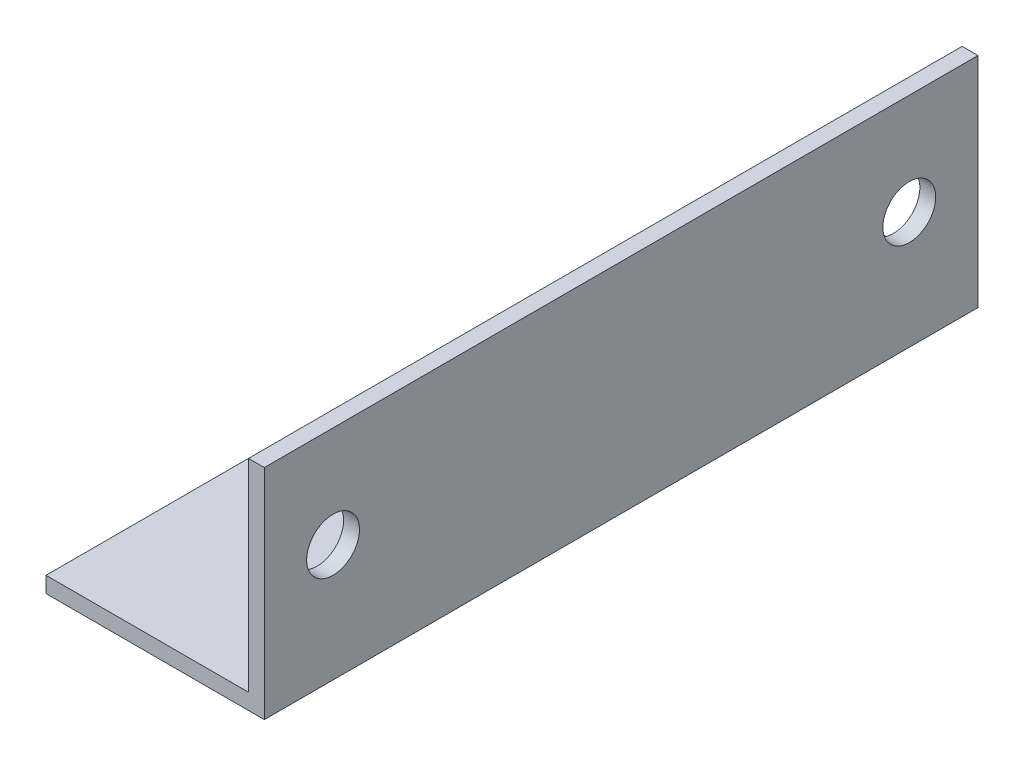
ISO-10303-21;
HEADER;
FILE_DESCRIPTION(('STEP AP214'),'2;1');
FILE_NAME('part.step','',(''),(''),'','','');
FILE_SCHEMA(('AUTOMOTIVE_DESIGN { 1 0 10303 214 1 1 1 1 }'));
ENDSEC;
DATA;
#1=APPLICATION_CONTEXT('core data for automotive mechanical design processes');
#2=APPLICATION_PROTOCOL_DEFINITION('international standard','automotive_design',2000,#1);
#3=PRODUCT_CONTEXT('',#1,'mechanical');
#4=PRODUCT('Part','Part','',(#3));
#5=PRODUCT_RELATED_PRODUCT_CATEGORY('part','',(#4));
#6=PRODUCT_DEFINITION_FORMATION('','',#4);
#7=PRODUCT_DEFINITION_CONTEXT('part definition',#1,'design');
#8=PRODUCT_DEFINITION('design','',#6,#7);
#9=PRODUCT_DEFINITION_SHAPE('','',#8);
#10=(LENGTH_UNIT() NAMED_UNIT(*) SI_UNIT(.MILLI.,.METRE.));
#11=(NAMED_UNIT(*) PLANE_ANGLE_UNIT() SI_UNIT($,.RADIAN.));
#12=(NAMED_UNIT(*) SI_UNIT($,.STERADIAN.) SOLID_ANGLE_UNIT());
#13=UNCERTAINTY_MEASURE_WITH_UNIT(LENGTH_MEASURE(1.E-05),#10,'distance_accuracy_value','');
#14=(GEOMETRIC_REPRESENTATION_CONTEXT(3) GLOBAL_UNCERTAINTY_ASSIGNED_CONTEXT((#13)) GLOBAL_UNIT_ASSIGNED_CONTEXT((#10,
#11,#12)) REPRESENTATION_CONTEXT('',''));
#15=CARTESIAN_POINT('',(0.,0.,0.));
#16=DIRECTION('',(0.,0.,1.));
#17=DIRECTION('',(1.,0.,0.));
#18=AXIS2_PLACEMENT_3D('',#15,#16,#17);
#19=CARTESIAN_POINT('',(0.,1.2,54.));
#20=DIRECTION('',(1.,0.,0.));
#21=DIRECTION('',(0.,1.,0.));
#22=AXIS2_PLACEMENT_3D('',#19,#20,#21);
#23=PLANE('',#22);
#24=DIRECTION('',(0.,-1.,0.));
#25=VECTOR('',#24,1.);
#26=CARTESIAN_POINT('',(0.,1.2,0.));
#27=LINE('',#26,#25);
#28=CARTESIAN_POINT('',(0.,1.2,0.));
#29=VERTEX_POINT('',#28);
#30=CARTESIAN_POINT('',(0.,0.,0.));
#31=VERTEX_POINT('',#30);
#32=EDGE_CURVE('E130',#29,#31,#27,.T.);
#33=ORIENTED_EDGE('',*,*,#32,.T.);
#34=DIRECTION('',(0.,0.,-1.));
#35=VECTOR('',#34,1.);
#36=CARTESIAN_POINT('',(0.,0.,54.));
#37=LINE('',#36,#35);
#38=CARTESIAN_POINT('',(0.,0.,54.));
#39=VERTEX_POINT('',#38);
#40=EDGE_CURVE('E11',#39,#31,#37,.T.);
#41=ORIENTED_EDGE('',*,*,#40,.F.);
#42=DIRECTION('',(0.,-1.,0.));
#43=VECTOR('',#42,1.);
#44=CARTESIAN_POINT('',(0.,1.2,54.));
#45=LINE('',#44,#43);
#46=CARTESIAN_POINT('',(0.,1.2,54.));
#47=VERTEX_POINT('',#46);
#48=EDGE_CURVE('E147',#47,#39,#45,.T.);
#49=ORIENTED_EDGE('',*,*,#48,.F.);
#50=DIRECTION('',(0.,0.,-1.));
#51=VECTOR('',#50,1.);
#52=CARTESIAN_POINT('',(0.,1.2,54.));
#53=LINE('',#52,#51);
#54=EDGE_CURVE('E126',#47,#29,#53,.T.);
#55=ORIENTED_EDGE('',*,*,#54,.T.);
#56=EDGE_LOOP('',(#33,#41,#49,#55));
#57=FACE_BOUND('',#56,.T.);
#58=ADVANCED_FACE('F39',(#57),#23,.F.);
#59=CARTESIAN_POINT('',(0.,0.,54.));
#60=DIRECTION('',(0.,1.,0.));
#61=DIRECTION('',(0.,0.,1.));
#62=AXIS2_PLACEMENT_3D('',#59,#60,#61);
#63=PLANE('',#62);
#64=DIRECTION('',(1.,0.,0.));
#65=VECTOR('',#64,1.);
#66=CARTESIAN_POINT('',(0.,0.,0.));
#67=LINE('',#66,#65);
#68=CARTESIAN_POINT('',(16.52,0.,0.));
#69=VERTEX_POINT('',#68);
#70=EDGE_CURVE('E134',#31,#69,#67,.T.);
#71=ORIENTED_EDGE('',*,*,#70,.T.);
#72=DIRECTION('',(0.,0.,-1.));
#73=VECTOR('',#72,1.);
#74=CARTESIAN_POINT('',(16.52,0.,54.));
#75=LINE('',#74,#73);
#76=CARTESIAN_POINT('',(16.52,0.,54.));
#77=VERTEX_POINT('',#76);
#78=EDGE_CURVE('E49',#77,#69,#75,.T.);
#79=ORIENTED_EDGE('',*,*,#78,.F.);
#80=DIRECTION('',(1.,0.,0.));
#81=VECTOR('',#80,1.);
#82=CARTESIAN_POINT('',(0.,0.,54.));
#83=LINE('',#82,#81);
#84=EDGE_CURVE('E95',#39,#77,#83,.T.);
#85=ORIENTED_EDGE('',*,*,#84,.F.);
#86=ORIENTED_EDGE('',*,*,#40,.T.);
#87=EDGE_LOOP('',(#71,#79,#85,#86));
#88=FACE_BOUND('',#87,.T.);
#89=ADVANCED_FACE('F179',(#88),#63,.F.);
#90=CARTESIAN_POINT('',(16.52,0.,54.));
#91=DIRECTION('',(-1.,0.,0.));
#92=DIRECTION('',(0.,0.,1.));
#93=AXIS2_PLACEMENT_3D('',#90,#91,#92);
#94=PLANE('',#93);
#95=CARTESIAN_POINT('',(16.52,8.86,5.2));
#96=DIRECTION('',(-1.,0.,0.));
#97=DIRECTION('',(0.,0.,1.));
#98=AXIS2_PLACEMENT_3D('',#95,#96,#97);
#99=CIRCLE('',#98,2.);
#100=CARTESIAN_POINT('',(16.52,8.86,7.2));
#101=VERTEX_POINT('',#100);
#102=EDGE_CURVE('E135',#101,#101,#99,.F.);
#103=ORIENTED_EDGE('',*,*,#102,.F.);
#104=EDGE_LOOP('',(#103));
#105=FACE_BOUND('',#104,.T.);
#106=CARTESIAN_POINT('',(16.52,8.86,48.8));
#107=DIRECTION('',(-1.,0.,0.));
#108=DIRECTION('',(0.,0.,1.));
#109=AXIS2_PLACEMENT_3D('',#106,#107,#108);
#110=CIRCLE('',#109,2.);
#111=CARTESIAN_POINT('',(16.52,8.86,50.8));
#112=VERTEX_POINT('',#111);
#113=EDGE_CURVE('E159',#112,#112,#110,.F.);
#114=ORIENTED_EDGE('',*,*,#113,.F.);
#115=EDGE_LOOP('',(#114));
#116=FACE_BOUND('',#115,.T.);
#117=DIRECTION('',(0.,1.,0.));
#118=VECTOR('',#117,1.);
#119=CARTESIAN_POINT('',(16.52,0.,0.));
#120=LINE('',#119,#118);
#121=CARTESIAN_POINT('',(16.52,16.52,0.));
#122=VERTEX_POINT('',#121);
#123=EDGE_CURVE('E138',#69,#122,#120,.T.);
#124=ORIENTED_EDGE('',*,*,#123,.T.);
#125=DIRECTION('',(0.,0.,-1.));
#126=VECTOR('',#125,1.);
#127=CARTESIAN_POINT('',(16.52,16.52,54.));
#128=LINE('',#127,#126);
#129=CARTESIAN_POINT('',(16.52,16.52,54.));
#130=VERTEX_POINT('',#129);
#131=EDGE_CURVE('E119',#130,#122,#128,.T.);
#132=ORIENTED_EDGE('',*,*,#131,.F.);
#133=DIRECTION('',(0.,1.,0.));
#134=VECTOR('',#133,1.);
#135=CARTESIAN_POINT('',(16.52,0.,54.));
#136=LINE('',#135,#134);
#137=EDGE_CURVE('E108',#77,#130,#136,.T.);
#138=ORIENTED_EDGE('',*,*,#137,.F.);
#139=ORIENTED_EDGE('',*,*,#78,.T.);
#140=EDGE_LOOP('',(#124,#132,#138,#139));
#141=FACE_BOUND('',#140,.T.);
#142=ADVANCED_FACE('F182',(#105,#116,#141),#94,.F.);
#143=CARTESIAN_POINT('',(16.52,16.52,54.));
#144=DIRECTION('',(0.,-1.,0.));
#145=DIRECTION('',(0.,0.,-1.));
#146=AXIS2_PLACEMENT_3D('',#143,#144,#145);
#147=PLANE('',#146);
#148=DIRECTION('',(-1.,0.,0.));
#149=VECTOR('',#148,1.);
#150=CARTESIAN_POINT('',(16.52,16.52,0.));
#151=LINE('',#150,#149);
#152=CARTESIAN_POINT('',(15.32,16.52,0.));
#153=VERTEX_POINT('',#152);
#154=EDGE_CURVE('E117',#122,#153,#151,.T.);
#155=ORIENTED_EDGE('',*,*,#154,.T.);
#156=DIRECTION('',(0.,0.,-1.));
#157=VECTOR('',#156,1.);
#158=CARTESIAN_POINT('',(15.32,16.52,54.));
#159=LINE('',#158,#157);
#160=CARTESIAN_POINT('',(15.32,16.52,54.));
#161=VERTEX_POINT('',#160);
#162=EDGE_CURVE('E114',#161,#153,#159,.T.);
#163=ORIENTED_EDGE('',*,*,#162,.F.);
#164=DIRECTION('',(-1.,0.,0.));
#165=VECTOR('',#164,1.);
#166=CARTESIAN_POINT('',(16.52,16.52,54.));
#167=LINE('',#166,#165);
#168=EDGE_CURVE('E102',#130,#161,#167,.T.);
#169=ORIENTED_EDGE('',*,*,#168,.F.);
#170=ORIENTED_EDGE('',*,*,#131,.T.);
#171=EDGE_LOOP('',(#155,#163,#169,#170));
#172=FACE_BOUND('',#171,.T.);
#173=ADVANCED_FACE('F115',(#172),#147,.F.);
#174=CARTESIAN_POINT('',(15.32,16.52,54.));
#175=DIRECTION('',(1.,0.,0.));
#176=DIRECTION('',(0.,1.,0.));
#177=AXIS2_PLACEMENT_3D('',#174,#175,#176);
#178=PLANE('',#177);
#179=CARTESIAN_POINT('',(15.32,8.86,5.2));
#180=DIRECTION('',(1.,0.,0.));
#181=DIRECTION('',(0.,1.,0.));
#182=AXIS2_PLACEMENT_3D('',#179,#180,#181);
#183=CIRCLE('',#182,2.);
#184=CARTESIAN_POINT('',(15.32,10.86,5.2));
#185=VERTEX_POINT('',#184);
#186=EDGE_CURVE('E42',#185,#185,#183,.F.);
#187=ORIENTED_EDGE('',*,*,#186,.F.);
#188=EDGE_LOOP('',(#187));
#189=FACE_BOUND('',#188,.T.);
#190=CARTESIAN_POINT('',(15.32,8.86,48.8));
#191=DIRECTION('',(1.,0.,0.));
#192=DIRECTION('',(0.,1.,0.));
#193=AXIS2_PLACEMENT_3D('',#190,#191,#192);
#194=CIRCLE('',#193,2.);
#195=CARTESIAN_POINT('',(15.32,10.86,48.8));
#196=VERTEX_POINT('',#195);
#197=EDGE_CURVE('E156',#196,#196,#194,.F.);
#198=ORIENTED_EDGE('',*,*,#197,.F.);
#199=EDGE_LOOP('',(#198));
#200=FACE_BOUND('',#199,.T.);
#201=DIRECTION('',(0.,-1.,0.));
#202=VECTOR('',#201,1.);
#203=CARTESIAN_POINT('',(15.32,16.52,0.));
#204=LINE('',#203,#202);
#205=CARTESIAN_POINT('',(15.32,1.2,0.));
#206=VERTEX_POINT('',#205);
#207=EDGE_CURVE('E81',#153,#206,#204,.T.);
#208=ORIENTED_EDGE('',*,*,#207,.T.);
#209=DIRECTION('',(0.,0.,-1.));
#210=VECTOR('',#209,1.);
#211=CARTESIAN_POINT('',(15.32,1.2,54.));
#212=LINE('',#211,#210);
#213=CARTESIAN_POINT('',(15.32,1.2,54.));
#214=VERTEX_POINT('',#213);
#215=EDGE_CURVE('E120',#214,#206,#212,.T.);
#216=ORIENTED_EDGE('',*,*,#215,.F.);
#217=DIRECTION('',(0.,-1.,0.));
#218=VECTOR('',#217,1.);
#219=CARTESIAN_POINT('',(15.32,16.52,54.));
#220=LINE('',#219,#218);
#221=EDGE_CURVE('E106',#161,#214,#220,.T.);
#222=ORIENTED_EDGE('',*,*,#221,.F.);
#223=ORIENTED_EDGE('',*,*,#162,.T.);
#224=EDGE_LOOP('',(#208,#216,#222,#223));
#225=FACE_BOUND('',#224,.T.);
#226=ADVANCED_FACE('F122',(#189,#200,#225),#178,.F.);
#227=CARTESIAN_POINT('',(15.32,1.2,54.));
#228=DIRECTION('',(0.,-1.,0.));
#229=DIRECTION('',(1.,0.,0.));
#230=AXIS2_PLACEMENT_3D('',#227,#228,#229);
#231=PLANE('',#230);
#232=DIRECTION('',(-1.,0.,0.));
#233=VECTOR('',#232,1.);
#234=CARTESIAN_POINT('',(15.32,1.2,0.));
#235=LINE('',#234,#233);
#236=EDGE_CURVE('E87',#206,#29,#235,.T.);
#237=ORIENTED_EDGE('',*,*,#236,.T.);
#238=ORIENTED_EDGE('',*,*,#54,.F.);
#239=DIRECTION('',(-1.,0.,0.));
#240=VECTOR('',#239,1.);
#241=CARTESIAN_POINT('',(15.32,1.2,54.));
#242=LINE('',#241,#240);
#243=EDGE_CURVE('E58',#214,#47,#242,.T.);
#244=ORIENTED_EDGE('',*,*,#243,.F.);
#245=ORIENTED_EDGE('',*,*,#215,.T.);
#246=EDGE_LOOP('',(#237,#238,#244,#245));
#247=FACE_BOUND('',#246,.T.);
#248=ADVANCED_FACE('F187',(#247),#231,.F.);
#249=CARTESIAN_POINT('',(0.,0.,54.));
#250=DIRECTION('',(0.,0.,1.));
#251=DIRECTION('',(1.,0.,0.));
#252=AXIS2_PLACEMENT_3D('',#249,#250,#251);
#253=PLANE('',#252);
#254=ORIENTED_EDGE('',*,*,#48,.T.);
#255=ORIENTED_EDGE('',*,*,#84,.T.);
#256=ORIENTED_EDGE('',*,*,#137,.T.);
#257=ORIENTED_EDGE('',*,*,#168,.T.);
#258=ORIENTED_EDGE('',*,*,#221,.T.);
#259=ORIENTED_EDGE('',*,*,#243,.T.);
#260=EDGE_LOOP('',(#254,#255,#256,#257,#258,#259));
#261=FACE_BOUND('',#260,.T.);
#262=ADVANCED_FACE('F104',(#261),#253,.T.);
#263=CARTESIAN_POINT('',(0.,0.,0.));
#264=DIRECTION('',(0.,0.,1.));
#265=DIRECTION('',(1.,0.,0.));
#266=AXIS2_PLACEMENT_3D('',#263,#264,#265);
#267=PLANE('',#266);
#268=ORIENTED_EDGE('',*,*,#32,.F.);
#269=ORIENTED_EDGE('',*,*,#236,.F.);
#270=ORIENTED_EDGE('',*,*,#207,.F.);
#271=ORIENTED_EDGE('',*,*,#154,.F.);
#272=ORIENTED_EDGE('',*,*,#123,.F.);
#273=ORIENTED_EDGE('',*,*,#70,.F.);
#274=EDGE_LOOP('',(#268,#269,#270,#271,#272,#273));
#275=FACE_BOUND('',#274,.T.);
#276=ADVANCED_FACE('F185',(#275),#267,.F.);
#277=CARTESIAN_POINT('',(24.,8.86,48.8));
#278=DIRECTION('',(-1.,0.,0.));
#279=DIRECTION('',(0.,0.,1.));
#280=AXIS2_PLACEMENT_3D('',#277,#278,#279);
#281=CYLINDRICAL_SURFACE('',#280,2.);
#282=ORIENTED_EDGE('',*,*,#197,.T.);
#283=EDGE_LOOP('',(#282));
#284=FACE_BOUND('',#283,.T.);
#285=ORIENTED_EDGE('',*,*,#113,.T.);
#286=EDGE_LOOP('',(#285));
#287=FACE_BOUND('',#286,.T.);
#288=ADVANCED_FACE('F226',(#284,#287),#281,.F.);
#289=CARTESIAN_POINT('',(24.,8.86,5.2));
#290=DIRECTION('',(-1.,0.,0.));
#291=DIRECTION('',(0.,0.,1.));
#292=AXIS2_PLACEMENT_3D('',#289,#290,#291);
#293=CYLINDRICAL_SURFACE('',#292,2.);
#294=ORIENTED_EDGE('',*,*,#186,.T.);
#295=EDGE_LOOP('',(#294));
#296=FACE_BOUND('',#295,.T.);
#297=ORIENTED_EDGE('',*,*,#102,.T.);
#298=EDGE_LOOP('',(#297));
#299=FACE_BOUND('',#298,.T.);
#300=ADVANCED_FACE('F231',(#296,#299),#293,.F.);
#301=CLOSED_SHELL('',(#58,#89,#142,#173,#226,#248,#262,#276,#288,#300));
#302=MANIFOLD_SOLID_BREP('B2',#301);
#303=ADVANCED_BREP_SHAPE_REPRESENTATION('',(#18,#302),#14);
#304=SHAPE_DEFINITION_REPRESENTATION(#9,#303);
ENDSEC;
END-ISO-10303-21;
